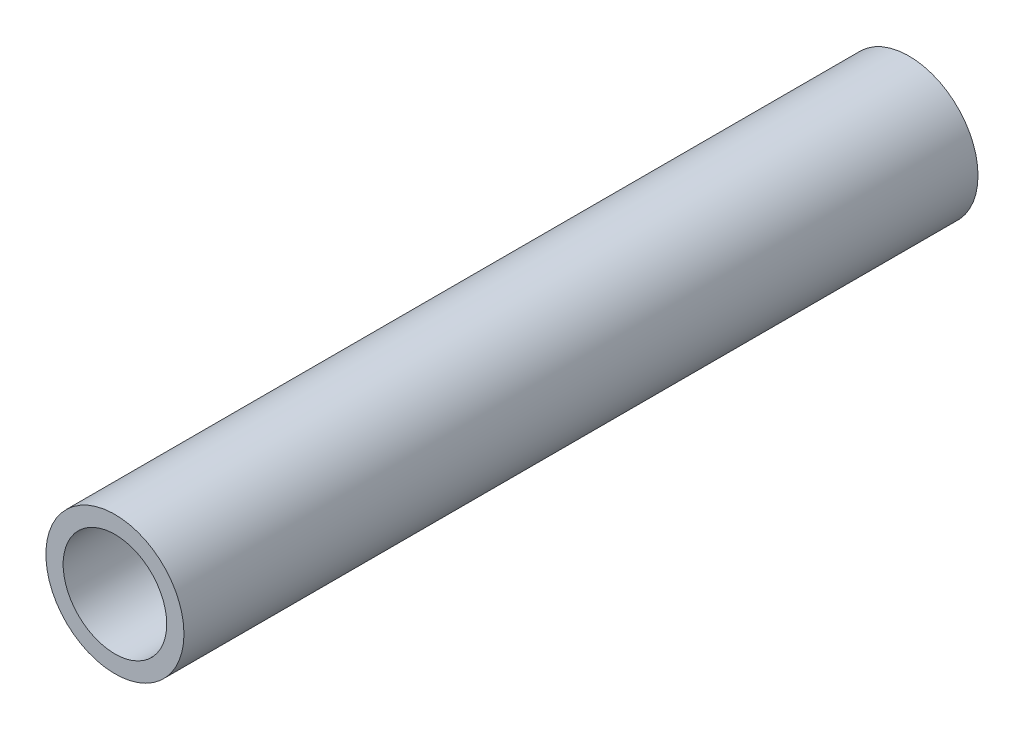
ISO-10303-21;
HEADER;
FILE_DESCRIPTION(('STEP AP214'),'2;1');
FILE_NAME('part.step','',(''),(''),'','','');
FILE_SCHEMA(('AUTOMOTIVE_DESIGN { 1 0 10303 214 1 1 1 1 }'));
ENDSEC;
DATA;
#1=APPLICATION_CONTEXT('core data for automotive mechanical design processes');
#2=APPLICATION_PROTOCOL_DEFINITION('international standard','automotive_design',2000,#1);
#3=PRODUCT_CONTEXT('',#1,'mechanical');
#4=PRODUCT('Part','Part','',(#3));
#5=PRODUCT_RELATED_PRODUCT_CATEGORY('part','',(#4));
#6=PRODUCT_DEFINITION_FORMATION('','',#4);
#7=PRODUCT_DEFINITION_CONTEXT('part definition',#1,'design');
#8=PRODUCT_DEFINITION('design','',#6,#7);
#9=PRODUCT_DEFINITION_SHAPE('','',#8);
#10=(LENGTH_UNIT() NAMED_UNIT(*) SI_UNIT(.MILLI.,.METRE.));
#11=(NAMED_UNIT(*) PLANE_ANGLE_UNIT() SI_UNIT($,.RADIAN.));
#12=(NAMED_UNIT(*) SI_UNIT($,.STERADIAN.) SOLID_ANGLE_UNIT());
#13=UNCERTAINTY_MEASURE_WITH_UNIT(LENGTH_MEASURE(1.E-05),#10,'distance_accuracy_value','');
#14=(GEOMETRIC_REPRESENTATION_CONTEXT(3) GLOBAL_UNCERTAINTY_ASSIGNED_CONTEXT((#13)) GLOBAL_UNIT_ASSIGNED_CONTEXT((#10,
#11,#12)) REPRESENTATION_CONTEXT('',''));
#15=CARTESIAN_POINT('',(0.,0.,0.));
#16=DIRECTION('',(0.,0.,1.));
#17=DIRECTION('',(1.,0.,0.));
#18=AXIS2_PLACEMENT_3D('',#15,#16,#17);
#19=CARTESIAN_POINT('',(0.,0.,46.));
#20=DIRECTION('',(0.,0.,1.));
#21=DIRECTION('',(1.,0.,0.));
#22=AXIS2_PLACEMENT_3D('',#19,#20,#21);
#23=PLANE('',#22);
#24=CARTESIAN_POINT('',(0.,0.,46.));
#25=DIRECTION('',(0.,0.,1.));
#26=DIRECTION('',(1.,0.,0.));
#27=AXIS2_PLACEMENT_3D('',#24,#25,#26);
#28=CIRCLE('',#27,4.);
#29=CARTESIAN_POINT('',(4.,0.,46.));
#30=VERTEX_POINT('',#29);
#31=EDGE_CURVE('E10',#30,#30,#28,.T.);
#32=ORIENTED_EDGE('',*,*,#31,.T.);
#33=EDGE_LOOP('',(#32));
#34=FACE_BOUND('',#33,.T.);
#35=CARTESIAN_POINT('',(0.,0.,46.));
#36=DIRECTION('',(0.,0.,1.));
#37=DIRECTION('',(1.,0.,0.));
#38=AXIS2_PLACEMENT_3D('',#35,#36,#37);
#39=CIRCLE('',#38,3.);
#40=CARTESIAN_POINT('',(3.,0.,46.));
#41=VERTEX_POINT('',#40);
#42=EDGE_CURVE('E25',#41,#41,#39,.T.);
#43=ORIENTED_EDGE('',*,*,#42,.F.);
#44=EDGE_LOOP('',(#43));
#45=FACE_BOUND('',#44,.T.);
#46=ADVANCED_FACE('F14',(#34,#45),#23,.T.);
#47=CARTESIAN_POINT('',(0.,0.,0.));
#48=DIRECTION('',(0.,0.,1.));
#49=DIRECTION('',(1.,0.,0.));
#50=AXIS2_PLACEMENT_3D('',#47,#48,#49);
#51=PLANE('',#50);
#52=CARTESIAN_POINT('',(0.,0.,0.));
#53=DIRECTION('',(0.,0.,1.));
#54=DIRECTION('',(1.,0.,0.));
#55=AXIS2_PLACEMENT_3D('',#52,#53,#54);
#56=CIRCLE('',#55,4.);
#57=CARTESIAN_POINT('',(4.,0.,0.));
#58=VERTEX_POINT('',#57);
#59=EDGE_CURVE('E18',#58,#58,#56,.T.);
#60=ORIENTED_EDGE('',*,*,#59,.F.);
#61=EDGE_LOOP('',(#60));
#62=FACE_BOUND('',#61,.T.);
#63=CARTESIAN_POINT('',(0.,0.,0.));
#64=DIRECTION('',(0.,0.,1.));
#65=DIRECTION('',(1.,0.,0.));
#66=AXIS2_PLACEMENT_3D('',#63,#64,#65);
#67=CIRCLE('',#66,3.);
#68=CARTESIAN_POINT('',(3.,0.,0.));
#69=VERTEX_POINT('',#68);
#70=EDGE_CURVE('E27',#69,#69,#67,.T.);
#71=ORIENTED_EDGE('',*,*,#70,.T.);
#72=EDGE_LOOP('',(#71));
#73=FACE_BOUND('',#72,.T.);
#74=ADVANCED_FACE('F37',(#62,#73),#51,.F.);
#75=CARTESIAN_POINT('',(0.,0.,46.));
#76=DIRECTION('',(0.,0.,-1.));
#77=DIRECTION('',(-1.,0.,0.));
#78=AXIS2_PLACEMENT_3D('',#75,#76,#77);
#79=CYLINDRICAL_SURFACE('',#78,4.);
#80=ORIENTED_EDGE('',*,*,#31,.F.);
#81=EDGE_LOOP('',(#80));
#82=FACE_BOUND('',#81,.T.);
#83=ORIENTED_EDGE('',*,*,#59,.T.);
#84=EDGE_LOOP('',(#83));
#85=FACE_BOUND('',#84,.T.);
#86=ADVANCED_FACE('F16',(#82,#85),#79,.T.);
#87=CARTESIAN_POINT('',(0.,0.,46.));
#88=DIRECTION('',(0.,0.,-1.));
#89=DIRECTION('',(-1.,0.,0.));
#90=AXIS2_PLACEMENT_3D('',#87,#88,#89);
#91=CYLINDRICAL_SURFACE('',#90,3.);
#92=ORIENTED_EDGE('',*,*,#42,.T.);
#93=EDGE_LOOP('',(#92));
#94=FACE_BOUND('',#93,.T.);
#95=ORIENTED_EDGE('',*,*,#70,.F.);
#96=EDGE_LOOP('',(#95));
#97=FACE_BOUND('',#96,.T.);
#98=ADVANCED_FACE('F33',(#94,#97),#91,.F.);
#99=CLOSED_SHELL('',(#46,#74,#86,#98));
#100=MANIFOLD_SOLID_BREP('B1',#99);
#101=ADVANCED_BREP_SHAPE_REPRESENTATION('',(#18,#100),#14);
#102=SHAPE_DEFINITION_REPRESENTATION(#9,#101);
ENDSEC;
END-ISO-10303-21;
